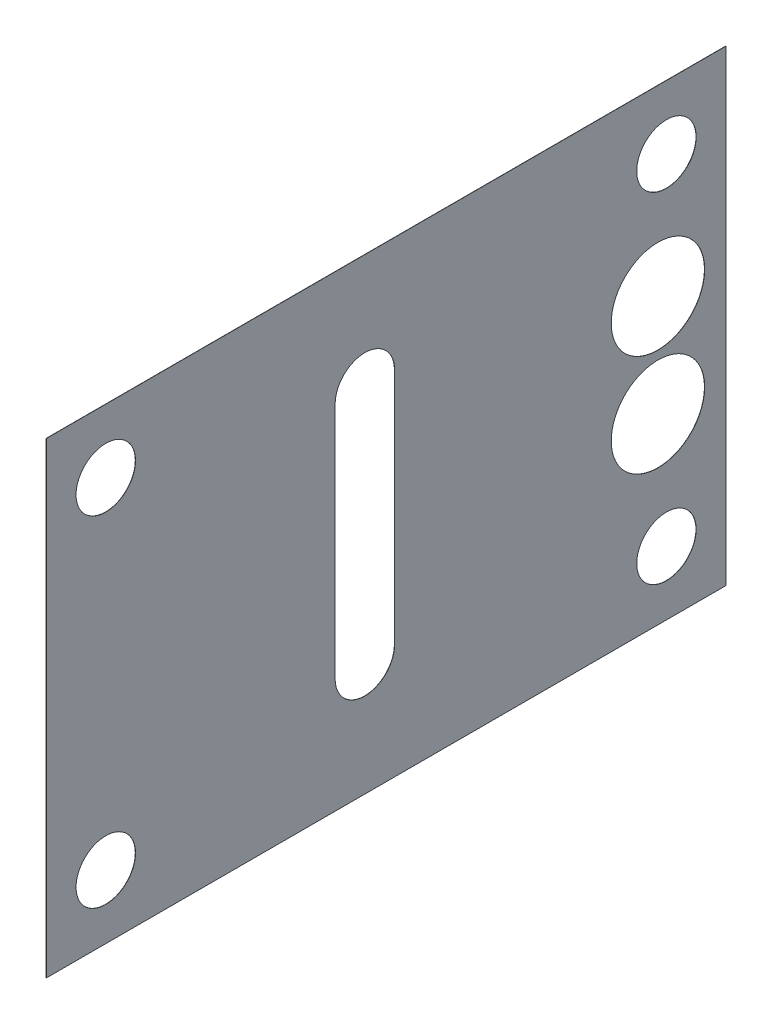
ISO-10303-21;
HEADER;
FILE_DESCRIPTION(('STEP AP214'),'2;1');
FILE_NAME('part.step','',(''),(''),'','','');
FILE_SCHEMA(('AUTOMOTIVE_DESIGN { 1 0 10303 214 1 1 1 1 }'));
ENDSEC;
DATA;
#1=APPLICATION_CONTEXT('core data for automotive mechanical design processes');
#2=APPLICATION_PROTOCOL_DEFINITION('international standard','automotive_design',2000,#1);
#3=PRODUCT_CONTEXT('',#1,'mechanical');
#4=PRODUCT('Part','Part','',(#3));
#5=PRODUCT_RELATED_PRODUCT_CATEGORY('part','',(#4));
#6=PRODUCT_DEFINITION_FORMATION('','',#4);
#7=PRODUCT_DEFINITION_CONTEXT('part definition',#1,'design');
#8=PRODUCT_DEFINITION('design','',#6,#7);
#9=PRODUCT_DEFINITION_SHAPE('','',#8);
#10=(LENGTH_UNIT() NAMED_UNIT(*) SI_UNIT(.MILLI.,.METRE.));
#11=(NAMED_UNIT(*) PLANE_ANGLE_UNIT() SI_UNIT($,.RADIAN.));
#12=(NAMED_UNIT(*) SI_UNIT($,.STERADIAN.) SOLID_ANGLE_UNIT());
#13=UNCERTAINTY_MEASURE_WITH_UNIT(LENGTH_MEASURE(1.E-05),#10,'distance_accuracy_value','');
#14=(GEOMETRIC_REPRESENTATION_CONTEXT(3) GLOBAL_UNCERTAINTY_ASSIGNED_CONTEXT((#13)) GLOBAL_UNIT_ASSIGNED_CONTEXT((#10,
#11,#12)) REPRESENTATION_CONTEXT('',''));
#15=CARTESIAN_POINT('',(0.,0.,0.));
#16=DIRECTION('',(0.,0.,1.));
#17=DIRECTION('',(1.,0.,0.));
#18=AXIS2_PLACEMENT_3D('',#15,#16,#17);
#19=CARTESIAN_POINT('',(0.0508,55.,80.));
#20=DIRECTION('',(0.,0.,-1.));
#21=DIRECTION('',(-1.,0.,0.));
#22=AXIS2_PLACEMENT_3D('',#19,#20,#21);
#23=PLANE('',#22);
#24=DIRECTION('',(0.,-1.,0.));
#25=VECTOR('',#24,1.);
#26=CARTESIAN_POINT('',(0.,55.,80.));
#27=LINE('',#26,#25);
#28=CARTESIAN_POINT('',(0.,55.,80.));
#29=VERTEX_POINT('',#28);
#30=CARTESIAN_POINT('',(0.,-55.,80.));
#31=VERTEX_POINT('',#30);
#32=EDGE_CURVE('E161',#29,#31,#27,.T.);
#33=ORIENTED_EDGE('',*,*,#32,.T.);
#34=DIRECTION('',(-1.,0.,0.));
#35=VECTOR('',#34,1.);
#36=CARTESIAN_POINT('',(0.0508,-55.,80.));
#37=LINE('',#36,#35);
#38=CARTESIAN_POINT('',(0.0508,-55.,80.));
#39=VERTEX_POINT('',#38);
#40=EDGE_CURVE('E11',#39,#31,#37,.T.);
#41=ORIENTED_EDGE('',*,*,#40,.F.);
#42=DIRECTION('',(0.,-1.,0.));
#43=VECTOR('',#42,1.);
#44=CARTESIAN_POINT('',(0.0508,55.,80.));
#45=LINE('',#44,#43);
#46=CARTESIAN_POINT('',(0.0508,55.,80.));
#47=VERTEX_POINT('',#46);
#48=EDGE_CURVE('E162',#47,#39,#45,.T.);
#49=ORIENTED_EDGE('',*,*,#48,.F.);
#50=DIRECTION('',(-1.,0.,0.));
#51=VECTOR('',#50,1.);
#52=CARTESIAN_POINT('',(0.0508,55.,80.));
#53=LINE('',#52,#51);
#54=EDGE_CURVE('E172',#47,#29,#53,.T.);
#55=ORIENTED_EDGE('',*,*,#54,.T.);
#56=EDGE_LOOP('',(#33,#41,#49,#55));
#57=FACE_BOUND('',#56,.T.);
#58=ADVANCED_FACE('F34',(#57),#23,.F.);
#59=CARTESIAN_POINT('',(0.0508,-55.,80.));
#60=DIRECTION('',(0.,1.,0.));
#61=DIRECTION('',(0.,0.,1.));
#62=AXIS2_PLACEMENT_3D('',#59,#60,#61);
#63=PLANE('',#62);
#64=DIRECTION('',(0.,0.,-1.));
#65=VECTOR('',#64,1.);
#66=CARTESIAN_POINT('',(0.,-55.,80.));
#67=LINE('',#66,#65);
#68=CARTESIAN_POINT('',(0.,-55.,-80.));
#69=VERTEX_POINT('',#68);
#70=EDGE_CURVE('E175',#31,#69,#67,.T.);
#71=ORIENTED_EDGE('',*,*,#70,.T.);
#72=DIRECTION('',(-1.,0.,0.));
#73=VECTOR('',#72,1.);
#74=CARTESIAN_POINT('',(0.0508,-55.,-80.));
#75=LINE('',#74,#73);
#76=CARTESIAN_POINT('',(0.0508,-55.,-80.));
#77=VERTEX_POINT('',#76);
#78=EDGE_CURVE('E41',#77,#69,#75,.T.);
#79=ORIENTED_EDGE('',*,*,#78,.F.);
#80=DIRECTION('',(0.,0.,-1.));
#81=VECTOR('',#80,1.);
#82=CARTESIAN_POINT('',(0.0508,-55.,80.));
#83=LINE('',#82,#81);
#84=EDGE_CURVE('E165',#39,#77,#83,.T.);
#85=ORIENTED_EDGE('',*,*,#84,.F.);
#86=ORIENTED_EDGE('',*,*,#40,.T.);
#87=EDGE_LOOP('',(#71,#79,#85,#86));
#88=FACE_BOUND('',#87,.T.);
#89=ADVANCED_FACE('F204',(#88),#63,.F.);
#90=CARTESIAN_POINT('',(0.0508,55.,-80.));
#91=DIRECTION('',(0.,0.,1.));
#92=DIRECTION('',(0.,-1.,0.));
#93=AXIS2_PLACEMENT_3D('',#90,#91,#92);
#94=PLANE('',#93);
#95=DIRECTION('',(0.,1.,0.));
#96=VECTOR('',#95,1.);
#97=CARTESIAN_POINT('',(0.,55.,-80.));
#98=LINE('',#97,#96);
#99=CARTESIAN_POINT('',(0.,55.,-80.));
#100=VERTEX_POINT('',#99);
#101=EDGE_CURVE('E177',#69,#100,#98,.T.);
#102=ORIENTED_EDGE('',*,*,#101,.T.);
#103=DIRECTION('',(-1.,0.,0.));
#104=VECTOR('',#103,1.);
#105=CARTESIAN_POINT('',(0.0508,55.,-80.));
#106=LINE('',#105,#104);
#107=CARTESIAN_POINT('',(0.0508,55.,-80.));
#108=VERTEX_POINT('',#107);
#109=EDGE_CURVE('E182',#108,#100,#106,.T.);
#110=ORIENTED_EDGE('',*,*,#109,.F.);
#111=DIRECTION('',(0.,1.,0.));
#112=VECTOR('',#111,1.);
#113=CARTESIAN_POINT('',(0.0508,55.,-80.));
#114=LINE('',#113,#112);
#115=EDGE_CURVE('E168',#77,#108,#114,.T.);
#116=ORIENTED_EDGE('',*,*,#115,.F.);
#117=ORIENTED_EDGE('',*,*,#78,.T.);
#118=EDGE_LOOP('',(#102,#110,#116,#117));
#119=FACE_BOUND('',#118,.T.);
#120=ADVANCED_FACE('F189',(#119),#94,.F.);
#121=CARTESIAN_POINT('',(0.0508,55.,80.));
#122=DIRECTION('',(0.,-1.,0.));
#123=DIRECTION('',(0.,0.,-1.));
#124=AXIS2_PLACEMENT_3D('',#121,#122,#123);
#125=PLANE('',#124);
#126=DIRECTION('',(0.,0.,1.));
#127=VECTOR('',#126,1.);
#128=CARTESIAN_POINT('',(0.,55.,80.));
#129=LINE('',#128,#127);
#130=EDGE_CURVE('E166',#100,#29,#129,.T.);
#131=ORIENTED_EDGE('',*,*,#130,.T.);
#132=ORIENTED_EDGE('',*,*,#54,.F.);
#133=DIRECTION('',(0.,0.,1.));
#134=VECTOR('',#133,1.);
#135=CARTESIAN_POINT('',(0.0508,55.,80.));
#136=LINE('',#135,#134);
#137=EDGE_CURVE('E170',#108,#47,#136,.T.);
#138=ORIENTED_EDGE('',*,*,#137,.F.);
#139=ORIENTED_EDGE('',*,*,#109,.T.);
#140=EDGE_LOOP('',(#131,#132,#138,#139));
#141=FACE_BOUND('',#140,.T.);
#142=ADVANCED_FACE('F197',(#141),#125,.F.);
#143=CARTESIAN_POINT('',(0.0508,0.,0.));
#144=DIRECTION('',(1.,0.,0.));
#145=DIRECTION('',(0.,0.,-1.));
#146=AXIS2_PLACEMENT_3D('',#143,#144,#145);
#147=PLANE('',#146);
#148=CARTESIAN_POINT('',(0.0507999999999995,12.,-64.));
#149=DIRECTION('',(1.,0.,0.));
#150=DIRECTION('',(0.,0.,-1.));
#151=AXIS2_PLACEMENT_3D('',#148,#149,#150);
#152=CIRCLE('',#151,11.);
#153=CARTESIAN_POINT('',(0.0507999999999995,12.,-75.));
#154=VERTEX_POINT('',#153);
#155=EDGE_CURVE('E262',#154,#154,#152,.T.);
#156=ORIENTED_EDGE('',*,*,#155,.F.);
#157=EDGE_LOOP('',(#156));
#158=FACE_BOUND('',#157,.T.);
#159=CARTESIAN_POINT('',(0.0507999999999995,-12.,-64.));
#160=DIRECTION('',(1.,0.,0.));
#161=DIRECTION('',(0.,0.,-1.));
#162=AXIS2_PLACEMENT_3D('',#159,#160,#161);
#163=CIRCLE('',#162,11.);
#164=CARTESIAN_POINT('',(0.0507999999999995,-12.,-75.));
#165=VERTEX_POINT('',#164);
#166=EDGE_CURVE('E264',#165,#165,#163,.T.);
#167=ORIENTED_EDGE('',*,*,#166,.F.);
#168=EDGE_LOOP('',(#167));
#169=FACE_BOUND('',#168,.T.);
#170=CARTESIAN_POINT('',(0.0508,28.,5.));
#171=DIRECTION('',(1.,0.,0.));
#172=DIRECTION('',(0.,0.,-1.));
#173=AXIS2_PLACEMENT_3D('',#170,#171,#172);
#174=CIRCLE('',#173,6.99999999999999);
#175=CARTESIAN_POINT('',(0.0508,28.,-1.99999999999998));
#176=VERTEX_POINT('',#175);
#177=CARTESIAN_POINT('',(0.0508,28.,12.));
#178=VERTEX_POINT('',#177);
#179=EDGE_CURVE('E48',#176,#178,#174,.T.);
#180=ORIENTED_EDGE('',*,*,#179,.F.);
#181=DIRECTION('',(0.,1.,0.));
#182=VECTOR('',#181,1.);
#183=CARTESIAN_POINT('',(0.0508,28.,-1.99999999999998));
#184=LINE('',#183,#182);
#185=CARTESIAN_POINT('',(0.0508,-28.,-2.));
#186=VERTEX_POINT('',#185);
#187=EDGE_CURVE('E116',#186,#176,#184,.T.);
#188=ORIENTED_EDGE('',*,*,#187,.F.);
#189=CARTESIAN_POINT('',(0.0508,-28.,5.));
#190=DIRECTION('',(1.,0.,0.));
#191=DIRECTION('',(0.,0.,-1.));
#192=AXIS2_PLACEMENT_3D('',#189,#190,#191);
#193=CIRCLE('',#192,7.);
#194=CARTESIAN_POINT('',(0.0508,-28.,12.));
#195=VERTEX_POINT('',#194);
#196=EDGE_CURVE('E119',#195,#186,#193,.T.);
#197=ORIENTED_EDGE('',*,*,#196,.F.);
#198=DIRECTION('',(0.,-1.,0.));
#199=VECTOR('',#198,1.);
#200=CARTESIAN_POINT('',(0.0508,28.,12.));
#201=LINE('',#200,#199);
#202=EDGE_CURVE('E128',#178,#195,#201,.T.);
#203=ORIENTED_EDGE('',*,*,#202,.F.);
#204=EDGE_LOOP('',(#180,#188,#197,#203));
#205=FACE_BOUND('',#204,.T.);
#206=CARTESIAN_POINT('',(0.0508,40.,66.));
#207=DIRECTION('',(1.,0.,0.));
#208=DIRECTION('',(0.,0.,-1.));
#209=AXIS2_PLACEMENT_3D('',#206,#207,#208);
#210=CIRCLE('',#209,7.);
#211=CARTESIAN_POINT('',(0.0508,40.,59.));
#212=VERTEX_POINT('',#211);
#213=EDGE_CURVE('E134',#212,#212,#210,.T.);
#214=ORIENTED_EDGE('',*,*,#213,.F.);
#215=EDGE_LOOP('',(#214));
#216=FACE_BOUND('',#215,.T.);
#217=CARTESIAN_POINT('',(0.0508,40.,-66.));
#218=DIRECTION('',(1.,0.,0.));
#219=DIRECTION('',(0.,0.,-1.));
#220=AXIS2_PLACEMENT_3D('',#217,#218,#219);
#221=CIRCLE('',#220,7.);
#222=CARTESIAN_POINT('',(0.0508,40.,-73.));
#223=VERTEX_POINT('',#222);
#224=EDGE_CURVE('E143',#223,#223,#221,.T.);
#225=ORIENTED_EDGE('',*,*,#224,.F.);
#226=EDGE_LOOP('',(#225));
#227=FACE_BOUND('',#226,.T.);
#228=CARTESIAN_POINT('',(0.0508,-40.,-66.));
#229=DIRECTION('',(1.,0.,0.));
#230=DIRECTION('',(0.,0.,-1.));
#231=AXIS2_PLACEMENT_3D('',#228,#229,#230);
#232=CIRCLE('',#231,7.);
#233=CARTESIAN_POINT('',(0.0508,-40.,-73.));
#234=VERTEX_POINT('',#233);
#235=EDGE_CURVE('E149',#234,#234,#232,.T.);
#236=ORIENTED_EDGE('',*,*,#235,.F.);
#237=EDGE_LOOP('',(#236));
#238=FACE_BOUND('',#237,.T.);
#239=CARTESIAN_POINT('',(0.0508,-40.,66.));
#240=DIRECTION('',(1.,0.,0.));
#241=DIRECTION('',(0.,0.,-1.));
#242=AXIS2_PLACEMENT_3D('',#239,#240,#241);
#243=CIRCLE('',#242,7.);
#244=CARTESIAN_POINT('',(0.0508,-40.,59.));
#245=VERTEX_POINT('',#244);
#246=EDGE_CURVE('E155',#245,#245,#243,.T.);
#247=ORIENTED_EDGE('',*,*,#246,.F.);
#248=EDGE_LOOP('',(#247));
#249=FACE_BOUND('',#248,.T.);
#250=ORIENTED_EDGE('',*,*,#48,.T.);
#251=ORIENTED_EDGE('',*,*,#84,.T.);
#252=ORIENTED_EDGE('',*,*,#115,.T.);
#253=ORIENTED_EDGE('',*,*,#137,.T.);
#254=EDGE_LOOP('',(#250,#251,#252,#253));
#255=FACE_BOUND('',#254,.T.);
#256=ADVANCED_FACE('F203',(#158,#169,#205,#216,#227,#238,#249,#255),#147,.T.);
#257=CARTESIAN_POINT('',(0.,0.,0.));
#258=DIRECTION('',(1.,0.,0.));
#259=DIRECTION('',(0.,0.,-1.));
#260=AXIS2_PLACEMENT_3D('',#257,#258,#259);
#261=PLANE('',#260);
#262=CARTESIAN_POINT('',(0.,12.,-64.));
#263=DIRECTION('',(1.,0.,0.));
#264=DIRECTION('',(0.,0.,-1.));
#265=AXIS2_PLACEMENT_3D('',#262,#263,#264);
#266=CIRCLE('',#265,11.);
#267=CARTESIAN_POINT('',(0.,12.,-75.));
#268=VERTEX_POINT('',#267);
#269=EDGE_CURVE('E259',#268,#268,#266,.T.);
#270=ORIENTED_EDGE('',*,*,#269,.T.);
#271=EDGE_LOOP('',(#270));
#272=FACE_BOUND('',#271,.T.);
#273=CARTESIAN_POINT('',(0.,-12.,-64.));
#274=DIRECTION('',(1.,0.,0.));
#275=DIRECTION('',(0.,0.,-1.));
#276=AXIS2_PLACEMENT_3D('',#273,#274,#275);
#277=CIRCLE('',#276,11.);
#278=CARTESIAN_POINT('',(0.,-12.,-75.));
#279=VERTEX_POINT('',#278);
#280=EDGE_CURVE('E122',#279,#279,#277,.T.);
#281=ORIENTED_EDGE('',*,*,#280,.T.);
#282=EDGE_LOOP('',(#281));
#283=FACE_BOUND('',#282,.T.);
#284=DIRECTION('',(0.,1.,0.));
#285=VECTOR('',#284,1.);
#286=CARTESIAN_POINT('',(0.,28.,-1.99999999999998));
#287=LINE('',#286,#285);
#288=CARTESIAN_POINT('',(0.,-28.,-2.));
#289=VERTEX_POINT('',#288);
#290=CARTESIAN_POINT('',(0.,28.,-1.99999999999998));
#291=VERTEX_POINT('',#290);
#292=EDGE_CURVE('E106',#289,#291,#287,.T.);
#293=ORIENTED_EDGE('',*,*,#292,.T.);
#294=CARTESIAN_POINT('',(0.,28.,5.));
#295=DIRECTION('',(1.,0.,0.));
#296=DIRECTION('',(0.,0.,-1.));
#297=AXIS2_PLACEMENT_3D('',#294,#295,#296);
#298=CIRCLE('',#297,6.99999999999999);
#299=CARTESIAN_POINT('',(0.,28.,12.));
#300=VERTEX_POINT('',#299);
#301=EDGE_CURVE('E100',#291,#300,#298,.T.);
#302=ORIENTED_EDGE('',*,*,#301,.T.);
#303=DIRECTION('',(0.,-1.,0.));
#304=VECTOR('',#303,1.);
#305=CARTESIAN_POINT('',(0.,28.,12.));
#306=LINE('',#305,#304);
#307=CARTESIAN_POINT('',(0.,-28.,12.));
#308=VERTEX_POINT('',#307);
#309=EDGE_CURVE('E109',#300,#308,#306,.T.);
#310=ORIENTED_EDGE('',*,*,#309,.T.);
#311=CARTESIAN_POINT('',(0.,-28.,5.));
#312=DIRECTION('',(1.,0.,0.));
#313=DIRECTION('',(0.,0.,-1.));
#314=AXIS2_PLACEMENT_3D('',#311,#312,#313);
#315=CIRCLE('',#314,7.);
#316=EDGE_CURVE('E56',#308,#289,#315,.T.);
#317=ORIENTED_EDGE('',*,*,#316,.T.);
#318=EDGE_LOOP('',(#293,#302,#310,#317));
#319=FACE_BOUND('',#318,.T.);
#320=CARTESIAN_POINT('',(0.,40.,66.));
#321=DIRECTION('',(1.,0.,0.));
#322=DIRECTION('',(0.,0.,-1.));
#323=AXIS2_PLACEMENT_3D('',#320,#321,#322);
#324=CIRCLE('',#323,7.);
#325=CARTESIAN_POINT('',(0.,40.,59.));
#326=VERTEX_POINT('',#325);
#327=EDGE_CURVE('E140',#326,#326,#324,.T.);
#328=ORIENTED_EDGE('',*,*,#327,.T.);
#329=EDGE_LOOP('',(#328));
#330=FACE_BOUND('',#329,.T.);
#331=CARTESIAN_POINT('',(0.,40.,-66.));
#332=DIRECTION('',(1.,0.,0.));
#333=DIRECTION('',(0.,0.,-1.));
#334=AXIS2_PLACEMENT_3D('',#331,#332,#333);
#335=CIRCLE('',#334,7.);
#336=CARTESIAN_POINT('',(0.,40.,-73.));
#337=VERTEX_POINT('',#336);
#338=EDGE_CURVE('E146',#337,#337,#335,.T.);
#339=ORIENTED_EDGE('',*,*,#338,.T.);
#340=EDGE_LOOP('',(#339));
#341=FACE_BOUND('',#340,.T.);
#342=CARTESIAN_POINT('',(0.,-40.,-66.));
#343=DIRECTION('',(1.,0.,0.));
#344=DIRECTION('',(0.,0.,-1.));
#345=AXIS2_PLACEMENT_3D('',#342,#343,#344);
#346=CIRCLE('',#345,7.);
#347=CARTESIAN_POINT('',(0.,-40.,-73.));
#348=VERTEX_POINT('',#347);
#349=EDGE_CURVE('E152',#348,#348,#346,.T.);
#350=ORIENTED_EDGE('',*,*,#349,.T.);
#351=EDGE_LOOP('',(#350));
#352=FACE_BOUND('',#351,.T.);
#353=CARTESIAN_POINT('',(0.,-40.,66.));
#354=DIRECTION('',(1.,0.,0.));
#355=DIRECTION('',(0.,0.,-1.));
#356=AXIS2_PLACEMENT_3D('',#353,#354,#355);
#357=CIRCLE('',#356,7.);
#358=CARTESIAN_POINT('',(0.,-40.,59.));
#359=VERTEX_POINT('',#358);
#360=EDGE_CURVE('E158',#359,#359,#357,.T.);
#361=ORIENTED_EDGE('',*,*,#360,.T.);
#362=EDGE_LOOP('',(#361));
#363=FACE_BOUND('',#362,.T.);
#364=ORIENTED_EDGE('',*,*,#32,.F.);
#365=ORIENTED_EDGE('',*,*,#130,.F.);
#366=ORIENTED_EDGE('',*,*,#101,.F.);
#367=ORIENTED_EDGE('',*,*,#70,.F.);
#368=EDGE_LOOP('',(#364,#365,#366,#367));
#369=FACE_BOUND('',#368,.T.);
#370=ADVANCED_FACE('F113',(#272,#283,#319,#330,#341,#352,#363,#369),#261,.F.);
#371=CARTESIAN_POINT('',(0.0508,-40.,66.));
#372=DIRECTION('',(1.,0.,0.));
#373=DIRECTION('',(0.,0.,-1.));
#374=AXIS2_PLACEMENT_3D('',#371,#372,#373);
#375=CYLINDRICAL_SURFACE('',#374,7.);
#376=ORIENTED_EDGE('',*,*,#360,.F.);
#377=EDGE_LOOP('',(#376));
#378=FACE_BOUND('',#377,.T.);
#379=ORIENTED_EDGE('',*,*,#246,.T.);
#380=EDGE_LOOP('',(#379));
#381=FACE_BOUND('',#380,.T.);
#382=ADVANCED_FACE('F216',(#378,#381),#375,.F.);
#383=CARTESIAN_POINT('',(0.0508,-40.,-66.));
#384=DIRECTION('',(1.,0.,0.));
#385=DIRECTION('',(0.,0.,-1.));
#386=AXIS2_PLACEMENT_3D('',#383,#384,#385);
#387=CYLINDRICAL_SURFACE('',#386,7.);
#388=ORIENTED_EDGE('',*,*,#349,.F.);
#389=EDGE_LOOP('',(#388));
#390=FACE_BOUND('',#389,.T.);
#391=ORIENTED_EDGE('',*,*,#235,.T.);
#392=EDGE_LOOP('',(#391));
#393=FACE_BOUND('',#392,.T.);
#394=ADVANCED_FACE('F223',(#390,#393),#387,.F.);
#395=CARTESIAN_POINT('',(0.0508,40.,-66.));
#396=DIRECTION('',(1.,0.,0.));
#397=DIRECTION('',(0.,0.,-1.));
#398=AXIS2_PLACEMENT_3D('',#395,#396,#397);
#399=CYLINDRICAL_SURFACE('',#398,7.);
#400=ORIENTED_EDGE('',*,*,#338,.F.);
#401=EDGE_LOOP('',(#400));
#402=FACE_BOUND('',#401,.T.);
#403=ORIENTED_EDGE('',*,*,#224,.T.);
#404=EDGE_LOOP('',(#403));
#405=FACE_BOUND('',#404,.T.);
#406=ADVANCED_FACE('F227',(#402,#405),#399,.F.);
#407=CARTESIAN_POINT('',(0.0508,40.,66.));
#408=DIRECTION('',(1.,0.,0.));
#409=DIRECTION('',(0.,0.,-1.));
#410=AXIS2_PLACEMENT_3D('',#407,#408,#409);
#411=CYLINDRICAL_SURFACE('',#410,7.);
#412=ORIENTED_EDGE('',*,*,#327,.F.);
#413=EDGE_LOOP('',(#412));
#414=FACE_BOUND('',#413,.T.);
#415=ORIENTED_EDGE('',*,*,#213,.T.);
#416=EDGE_LOOP('',(#415));
#417=FACE_BOUND('',#416,.T.);
#418=ADVANCED_FACE('F231',(#414,#417),#411,.F.);
#419=CARTESIAN_POINT('',(0.,28.,5.));
#420=DIRECTION('',(1.,0.,0.));
#421=DIRECTION('',(0.,0.,-1.));
#422=AXIS2_PLACEMENT_3D('',#419,#420,#421);
#423=CYLINDRICAL_SURFACE('',#422,6.99999999999999);
#424=ORIENTED_EDGE('',*,*,#179,.T.);
#425=DIRECTION('',(1.,0.,0.));
#426=VECTOR('',#425,1.);
#427=CARTESIAN_POINT('',(0.,28.,12.));
#428=LINE('',#427,#426);
#429=EDGE_CURVE('E96',#300,#178,#428,.T.);
#430=ORIENTED_EDGE('',*,*,#429,.F.);
#431=ORIENTED_EDGE('',*,*,#301,.F.);
#432=DIRECTION('',(1.,0.,0.));
#433=VECTOR('',#432,1.);
#434=CARTESIAN_POINT('',(0.,28.,-1.99999999999998));
#435=LINE('',#434,#433);
#436=EDGE_CURVE('E132',#291,#176,#435,.T.);
#437=ORIENTED_EDGE('',*,*,#436,.T.);
#438=EDGE_LOOP('',(#424,#430,#431,#437));
#439=FACE_BOUND('',#438,.T.);
#440=ADVANCED_FACE('F98',(#439),#423,.F.);
#441=CARTESIAN_POINT('',(0.,28.,-1.99999999999998));
#442=DIRECTION('',(0.,0.,-1.));
#443=DIRECTION('',(0.,1.,0.));
#444=AXIS2_PLACEMENT_3D('',#441,#442,#443);
#445=PLANE('',#444);
#446=ORIENTED_EDGE('',*,*,#187,.T.);
#447=ORIENTED_EDGE('',*,*,#436,.F.);
#448=ORIENTED_EDGE('',*,*,#292,.F.);
#449=DIRECTION('',(1.,0.,0.));
#450=VECTOR('',#449,1.);
#451=CARTESIAN_POINT('',(0.,-28.,-2.));
#452=LINE('',#451,#450);
#453=EDGE_CURVE('E135',#289,#186,#452,.T.);
#454=ORIENTED_EDGE('',*,*,#453,.T.);
#455=EDGE_LOOP('',(#446,#447,#448,#454));
#456=FACE_BOUND('',#455,.T.);
#457=ADVANCED_FACE('F238',(#456),#445,.F.);
#458=CARTESIAN_POINT('',(0.,-28.,5.));
#459=DIRECTION('',(1.,0.,0.));
#460=DIRECTION('',(0.,0.,-1.));
#461=AXIS2_PLACEMENT_3D('',#458,#459,#460);
#462=CYLINDRICAL_SURFACE('',#461,7.);
#463=ORIENTED_EDGE('',*,*,#196,.T.);
#464=ORIENTED_EDGE('',*,*,#453,.F.);
#465=ORIENTED_EDGE('',*,*,#316,.F.);
#466=DIRECTION('',(1.,0.,0.));
#467=VECTOR('',#466,1.);
#468=CARTESIAN_POINT('',(0.,-28.,12.));
#469=LINE('',#468,#467);
#470=EDGE_CURVE('E105',#308,#195,#469,.T.);
#471=ORIENTED_EDGE('',*,*,#470,.T.);
#472=EDGE_LOOP('',(#463,#464,#465,#471));
#473=FACE_BOUND('',#472,.T.);
#474=ADVANCED_FACE('F242',(#473),#462,.F.);
#475=CARTESIAN_POINT('',(0.,28.,12.));
#476=DIRECTION('',(0.,0.,1.));
#477=DIRECTION('',(1.,0.,0.));
#478=AXIS2_PLACEMENT_3D('',#475,#476,#477);
#479=PLANE('',#478);
#480=ORIENTED_EDGE('',*,*,#202,.T.);
#481=ORIENTED_EDGE('',*,*,#470,.F.);
#482=ORIENTED_EDGE('',*,*,#309,.F.);
#483=ORIENTED_EDGE('',*,*,#429,.T.);
#484=EDGE_LOOP('',(#480,#481,#482,#483));
#485=FACE_BOUND('',#484,.T.);
#486=ADVANCED_FACE('F110',(#485),#479,.F.);
#487=CARTESIAN_POINT('',(0.0508,-12.,-64.));
#488=DIRECTION('',(1.,0.,0.));
#489=DIRECTION('',(0.,0.,-1.));
#490=AXIS2_PLACEMENT_3D('',#487,#488,#489);
#491=CYLINDRICAL_SURFACE('',#490,11.);
#492=ORIENTED_EDGE('',*,*,#280,.F.);
#493=EDGE_LOOP('',(#492));
#494=FACE_BOUND('',#493,.T.);
#495=ORIENTED_EDGE('',*,*,#166,.T.);
#496=EDGE_LOOP('',(#495));
#497=FACE_BOUND('',#496,.T.);
#498=ADVANCED_FACE('F241',(#494,#497),#491,.F.);
#499=CARTESIAN_POINT('',(0.0508,12.,-64.));
#500=DIRECTION('',(1.,0.,0.));
#501=DIRECTION('',(0.,0.,-1.));
#502=AXIS2_PLACEMENT_3D('',#499,#500,#501);
#503=CYLINDRICAL_SURFACE('',#502,11.);
#504=ORIENTED_EDGE('',*,*,#269,.F.);
#505=EDGE_LOOP('',(#504));
#506=FACE_BOUND('',#505,.T.);
#507=ORIENTED_EDGE('',*,*,#155,.T.);
#508=EDGE_LOOP('',(#507));
#509=FACE_BOUND('',#508,.T.);
#510=ADVANCED_FACE('F250',(#506,#509),#503,.F.);
#511=CLOSED_SHELL('',(#58,#89,#120,#142,#256,#370,#382,#394,#406,#418,#440,#457,#474,#486,#498,#510));
#512=MANIFOLD_SOLID_BREP('B2',#511);
#513=ADVANCED_BREP_SHAPE_REPRESENTATION('',(#18,#512),#14);
#514=SHAPE_DEFINITION_REPRESENTATION(#9,#513);
ENDSEC;
END-ISO-10303-21;
